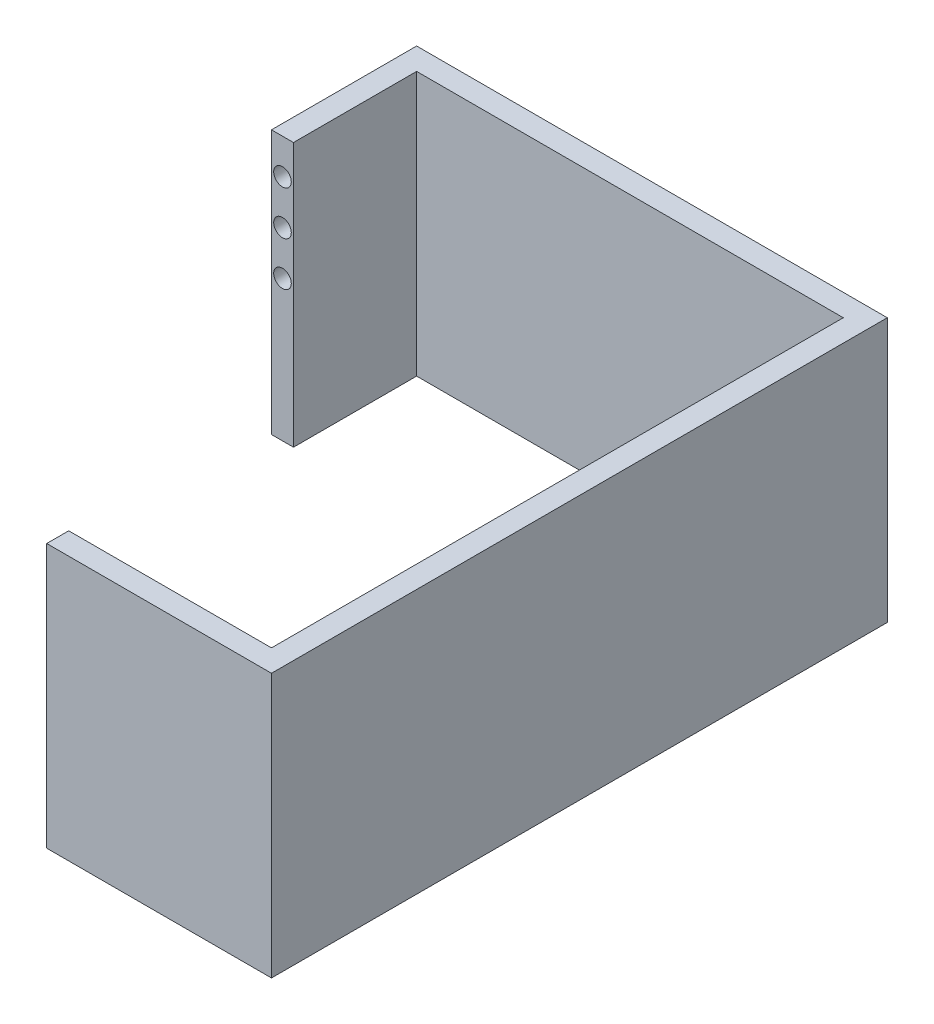
ISO-10303-21;
HEADER;
FILE_DESCRIPTION(('STEP AP214'),'2;1');
FILE_NAME('part.step','',(''),(''),'','','');
FILE_SCHEMA(('AUTOMOTIVE_DESIGN { 1 0 10303 214 1 1 1 1 }'));
ENDSEC;
DATA;
#1=APPLICATION_CONTEXT('core data for automotive mechanical design processes');
#2=APPLICATION_PROTOCOL_DEFINITION('international standard','automotive_design',2000,#1);
#3=PRODUCT_CONTEXT('',#1,'mechanical');
#4=PRODUCT('Part','Part','',(#3));
#5=PRODUCT_RELATED_PRODUCT_CATEGORY('part','',(#4));
#6=PRODUCT_DEFINITION_FORMATION('','',#4);
#7=PRODUCT_DEFINITION_CONTEXT('part definition',#1,'design');
#8=PRODUCT_DEFINITION('design','',#6,#7);
#9=PRODUCT_DEFINITION_SHAPE('','',#8);
#10=(LENGTH_UNIT() NAMED_UNIT(*) SI_UNIT(.MILLI.,.METRE.));
#11=(NAMED_UNIT(*) PLANE_ANGLE_UNIT() SI_UNIT($,.RADIAN.));
#12=(NAMED_UNIT(*) SI_UNIT($,.STERADIAN.) SOLID_ANGLE_UNIT());
#13=UNCERTAINTY_MEASURE_WITH_UNIT(LENGTH_MEASURE(1.E-05),#10,'distance_accuracy_value','');
#14=(GEOMETRIC_REPRESENTATION_CONTEXT(3) GLOBAL_UNCERTAINTY_ASSIGNED_CONTEXT((#13)) GLOBAL_UNIT_ASSIGNED_CONTEXT((#10,
#11,#12)) REPRESENTATION_CONTEXT('',''));
#15=CARTESIAN_POINT('',(0.,0.,0.));
#16=DIRECTION('',(0.,0.,1.));
#17=DIRECTION('',(1.,0.,0.));
#18=AXIS2_PLACEMENT_3D('',#15,#16,#17);
#19=CARTESIAN_POINT('',(-27.7844387904068,76.2,0.));
#20=DIRECTION('',(-1.,0.,0.));
#21=DIRECTION('',(0.,0.,1.));
#22=AXIS2_PLACEMENT_3D('',#19,#20,#21);
#23=PLANE('',#22);
#24=CARTESIAN_POINT('',(-27.7844387904068,40.64,7.40049259405421));
#25=DIRECTION('',(-1.,0.,0.));
#26=DIRECTION('',(0.,0.,1.));
#27=AXIS2_PLACEMENT_3D('',#24,#25,#26);
#28=CIRCLE('',#27,2.54);
#29=CARTESIAN_POINT('',(-27.7844387904068,40.64,9.94049259405421));
#30=VERTEX_POINT('',#29);
#31=EDGE_CURVE('E281',#30,#30,#28,.T.);
#32=ORIENTED_EDGE('',*,*,#31,.F.);
#33=EDGE_LOOP('',(#32));
#34=FACE_BOUND('',#33,.T.);
#35=CARTESIAN_POINT('',(-27.7844387904068,53.34,7.40049259405407));
#36=DIRECTION('',(-1.,0.,0.));
#37=DIRECTION('',(0.,0.,1.));
#38=AXIS2_PLACEMENT_3D('',#35,#36,#37);
#39=CIRCLE('',#38,2.54);
#40=CARTESIAN_POINT('',(-27.7844387904068,53.34,9.94049259405408));
#41=VERTEX_POINT('',#40);
#42=EDGE_CURVE('E273',#41,#41,#39,.T.);
#43=ORIENTED_EDGE('',*,*,#42,.F.);
#44=EDGE_LOOP('',(#43));
#45=FACE_BOUND('',#44,.T.);
#46=CARTESIAN_POINT('',(-27.7844387904068,66.04,7.40049259405394));
#47=DIRECTION('',(-1.,0.,0.));
#48=DIRECTION('',(0.,0.,1.));
#49=AXIS2_PLACEMENT_3D('',#46,#47,#48);
#50=CIRCLE('',#49,2.54);
#51=CARTESIAN_POINT('',(-27.7844387904068,66.04,9.94049259405394));
#52=VERTEX_POINT('',#51);
#53=EDGE_CURVE('E266',#52,#52,#50,.T.);
#54=ORIENTED_EDGE('',*,*,#53,.F.);
#55=EDGE_LOOP('',(#54));
#56=FACE_BOUND('',#55,.T.);
#57=DIRECTION('',(0.,0.,-1.));
#58=VECTOR('',#57,1.);
#59=CARTESIAN_POINT('',(-27.7844387904068,0.,0.));
#60=LINE('',#59,#58);
#61=CARTESIAN_POINT('',(-27.7844387904068,0.,10.5754925940539));
#62=VERTEX_POINT('',#61);
#63=CARTESIAN_POINT('',(-27.7844387904068,0.,4.22549259405394));
#64=VERTEX_POINT('',#63);
#65=EDGE_CURVE('E165',#62,#64,#60,.T.);
#66=ORIENTED_EDGE('',*,*,#65,.F.);
#67=DIRECTION('',(0.,-1.,0.));
#68=VECTOR('',#67,1.);
#69=CARTESIAN_POINT('',(-27.7844387904068,76.2,10.5754925940539));
#70=LINE('',#69,#68);
#71=CARTESIAN_POINT('',(-27.7844387904068,76.2,10.5754925940539));
#72=VERTEX_POINT('',#71);
#73=EDGE_CURVE('E11',#72,#62,#70,.T.);
#74=ORIENTED_EDGE('',*,*,#73,.F.);
#75=DIRECTION('',(0.,0.,-1.));
#76=VECTOR('',#75,1.);
#77=CARTESIAN_POINT('',(-27.7844387904068,76.2,0.));
#78=LINE('',#77,#76);
#79=CARTESIAN_POINT('',(-27.7844387904068,76.2,4.22549259405394));
#80=VERTEX_POINT('',#79);
#81=EDGE_CURVE('E199',#72,#80,#78,.T.);
#82=ORIENTED_EDGE('',*,*,#81,.T.);
#83=DIRECTION('',(0.,-1.,0.));
#84=VECTOR('',#83,1.);
#85=CARTESIAN_POINT('',(-27.7844387904068,76.2,4.22549259405394));
#86=LINE('',#85,#84);
#87=EDGE_CURVE('E105',#80,#64,#86,.T.);
#88=ORIENTED_EDGE('',*,*,#87,.T.);
#89=EDGE_LOOP('',(#66,#74,#82,#88));
#90=FACE_BOUND('',#89,.T.);
#91=ADVANCED_FACE('F40',(#34,#45,#56,#90),#23,.T.);
#92=CARTESIAN_POINT('',(0.,76.2,10.5754925940539));
#93=DIRECTION('',(0.,0.,1.));
#94=DIRECTION('',(1.,0.,0.));
#95=AXIS2_PLACEMENT_3D('',#92,#93,#94);
#96=PLANE('',#95);
#97=DIRECTION('',(-1.,0.,0.));
#98=VECTOR('',#97,1.);
#99=CARTESIAN_POINT('',(0.,0.,10.5754925940539));
#100=LINE('',#99,#98);
#101=CARTESIAN_POINT('',(37.1125612095932,0.,10.5754925940539));
#102=VERTEX_POINT('',#101);
#103=EDGE_CURVE('E169',#102,#62,#100,.T.);
#104=ORIENTED_EDGE('',*,*,#103,.F.);
#105=DIRECTION('',(0.,-1.,0.));
#106=VECTOR('',#105,1.);
#107=CARTESIAN_POINT('',(37.1125612095932,76.2,10.5754925940539));
#108=LINE('',#107,#106);
#109=CARTESIAN_POINT('',(37.1125612095932,76.2,10.5754925940539));
#110=VERTEX_POINT('',#109);
#111=EDGE_CURVE('E49',#110,#102,#108,.T.);
#112=ORIENTED_EDGE('',*,*,#111,.F.);
#113=DIRECTION('',(-1.,0.,0.));
#114=VECTOR('',#113,1.);
#115=CARTESIAN_POINT('',(0.,76.2,10.5754925940539));
#116=LINE('',#115,#114);
#117=EDGE_CURVE('E241',#110,#72,#116,.T.);
#118=ORIENTED_EDGE('',*,*,#117,.T.);
#119=ORIENTED_EDGE('',*,*,#73,.T.);
#120=EDGE_LOOP('',(#104,#112,#118,#119));
#121=FACE_BOUND('',#120,.T.);
#122=ADVANCED_FACE('F229',(#121),#96,.T.);
#123=CARTESIAN_POINT('',(37.1125612095932,76.2,0.));
#124=DIRECTION('',(1.,0.,0.));
#125=DIRECTION('',(0.,0.,-1.));
#126=AXIS2_PLACEMENT_3D('',#123,#124,#125);
#127=PLANE('',#126);
#128=DIRECTION('',(0.,0.,1.));
#129=VECTOR('',#128,1.);
#130=CARTESIAN_POINT('',(37.1125612095932,0.,0.));
#131=LINE('',#130,#129);
#132=CARTESIAN_POINT('',(37.1125612095932,0.,-167.224507405946));
#133=VERTEX_POINT('',#132);
#134=EDGE_CURVE('E174',#133,#102,#131,.T.);
#135=ORIENTED_EDGE('',*,*,#134,.F.);
#136=DIRECTION('',(0.,-1.,0.));
#137=VECTOR('',#136,1.);
#138=CARTESIAN_POINT('',(37.1125612095932,76.2,-167.224507405946));
#139=LINE('',#138,#137);
#140=CARTESIAN_POINT('',(37.1125612095932,76.2,-167.224507405946));
#141=VERTEX_POINT('',#140);
#142=EDGE_CURVE('E216',#141,#133,#139,.T.);
#143=ORIENTED_EDGE('',*,*,#142,.F.);
#144=DIRECTION('',(0.,0.,1.));
#145=VECTOR('',#144,1.);
#146=CARTESIAN_POINT('',(37.1125612095932,76.2,0.));
#147=LINE('',#146,#145);
#148=EDGE_CURVE('E225',#141,#110,#147,.T.);
#149=ORIENTED_EDGE('',*,*,#148,.T.);
#150=ORIENTED_EDGE('',*,*,#111,.T.);
#151=EDGE_LOOP('',(#135,#143,#149,#150));
#152=FACE_BOUND('',#151,.T.);
#153=ADVANCED_FACE('F223',(#152),#127,.T.);
#154=CARTESIAN_POINT('',(0.,76.2,-167.224507405946));
#155=DIRECTION('',(0.,0.,-1.));
#156=DIRECTION('',(-1.,0.,0.));
#157=AXIS2_PLACEMENT_3D('',#154,#155,#156);
#158=PLANE('',#157);
#159=DIRECTION('',(1.,0.,0.));
#160=VECTOR('',#159,1.);
#161=CARTESIAN_POINT('',(0.,0.,-167.224507405946));
#162=LINE('',#161,#160);
#163=CARTESIAN_POINT('',(-98.7774387904068,0.,-167.224507405946));
#164=VERTEX_POINT('',#163);
#165=EDGE_CURVE('E178',#164,#133,#162,.T.);
#166=ORIENTED_EDGE('',*,*,#165,.F.);
#167=DIRECTION('',(0.,-1.,0.));
#168=VECTOR('',#167,1.);
#169=CARTESIAN_POINT('',(-98.7774387904068,76.2,-167.224507405946));
#170=LINE('',#169,#168);
#171=CARTESIAN_POINT('',(-98.7774387904068,76.2,-167.224507405946));
#172=VERTEX_POINT('',#171);
#173=EDGE_CURVE('E213',#172,#164,#170,.T.);
#174=ORIENTED_EDGE('',*,*,#173,.F.);
#175=DIRECTION('',(1.,0.,0.));
#176=VECTOR('',#175,1.);
#177=CARTESIAN_POINT('',(0.,76.2,-167.224507405946));
#178=LINE('',#177,#176);
#179=EDGE_CURVE('E240',#172,#141,#178,.T.);
#180=ORIENTED_EDGE('',*,*,#179,.T.);
#181=ORIENTED_EDGE('',*,*,#142,.T.);
#182=EDGE_LOOP('',(#166,#174,#180,#181));
#183=FACE_BOUND('',#182,.T.);
#184=ADVANCED_FACE('F236',(#183),#158,.T.);
#185=CARTESIAN_POINT('',(-98.7774387904068,76.2,0.));
#186=DIRECTION('',(1.,0.,0.));
#187=DIRECTION('',(0.,0.,-1.));
#188=AXIS2_PLACEMENT_3D('',#185,#186,#187);
#189=PLANE('',#188);
#190=DIRECTION('',(0.,0.,1.));
#191=VECTOR('',#190,1.);
#192=CARTESIAN_POINT('',(-98.7774387904068,0.,0.));
#193=LINE('',#192,#191);
#194=CARTESIAN_POINT('',(-98.7774387904068,0.,-125.314507405946));
#195=VERTEX_POINT('',#194);
#196=EDGE_CURVE('E182',#164,#195,#193,.T.);
#197=ORIENTED_EDGE('',*,*,#196,.T.);
#198=DIRECTION('',(0.,-1.,0.));
#199=VECTOR('',#198,1.);
#200=CARTESIAN_POINT('',(-98.7774387904068,76.2,-125.314507405946));
#201=LINE('',#200,#199);
#202=CARTESIAN_POINT('',(-98.7774387904068,76.2,-125.314507405946));
#203=VERTEX_POINT('',#202);
#204=EDGE_CURVE('E209',#203,#195,#201,.T.);
#205=ORIENTED_EDGE('',*,*,#204,.F.);
#206=DIRECTION('',(0.,0.,1.));
#207=VECTOR('',#206,1.);
#208=CARTESIAN_POINT('',(-98.7774387904068,76.2,0.));
#209=LINE('',#208,#207);
#210=EDGE_CURVE('E245',#172,#203,#209,.T.);
#211=ORIENTED_EDGE('',*,*,#210,.F.);
#212=ORIENTED_EDGE('',*,*,#173,.T.);
#213=EDGE_LOOP('',(#197,#205,#211,#212));
#214=FACE_BOUND('',#213,.T.);
#215=ADVANCED_FACE('F323',(#214),#189,.F.);
#216=CARTESIAN_POINT('',(0.,76.2,-125.314507405946));
#217=DIRECTION('',(0.,0.,-1.));
#218=DIRECTION('',(-1.,0.,0.));
#219=AXIS2_PLACEMENT_3D('',#216,#217,#218);
#220=PLANE('',#219);
#221=CARTESIAN_POINT('',(-95.6024387904065,40.64,-125.314507405946));
#222=DIRECTION('',(0.,0.,1.));
#223=DIRECTION('',(1.,0.,0.));
#224=AXIS2_PLACEMENT_3D('',#221,#222,#223);
#225=CIRCLE('',#224,2.54);
#226=CARTESIAN_POINT('',(-93.0624387904065,40.64,-125.314507405946));
#227=VERTEX_POINT('',#226);
#228=EDGE_CURVE('E304',#227,#227,#225,.T.);
#229=ORIENTED_EDGE('',*,*,#228,.F.);
#230=EDGE_LOOP('',(#229));
#231=FACE_BOUND('',#230,.T.);
#232=CARTESIAN_POINT('',(-95.6024387904066,53.34,-125.314507405946));
#233=DIRECTION('',(0.,0.,1.));
#234=DIRECTION('',(1.,0.,0.));
#235=AXIS2_PLACEMENT_3D('',#232,#233,#234);
#236=CIRCLE('',#235,2.54);
#237=CARTESIAN_POINT('',(-93.0624387904066,53.34,-125.314507405946));
#238=VERTEX_POINT('',#237);
#239=EDGE_CURVE('E296',#238,#238,#236,.T.);
#240=ORIENTED_EDGE('',*,*,#239,.F.);
#241=EDGE_LOOP('',(#240));
#242=FACE_BOUND('',#241,.T.);
#243=CARTESIAN_POINT('',(-95.6024387904068,66.04,-125.314507405946));
#244=DIRECTION('',(0.,0.,1.));
#245=DIRECTION('',(1.,0.,0.));
#246=AXIS2_PLACEMENT_3D('',#243,#244,#245);
#247=CIRCLE('',#246,2.53999999999999);
#248=CARTESIAN_POINT('',(-93.0624387904068,66.04,-125.314507405946));
#249=VERTEX_POINT('',#248);
#250=EDGE_CURVE('E289',#249,#249,#247,.T.);
#251=ORIENTED_EDGE('',*,*,#250,.F.);
#252=EDGE_LOOP('',(#251));
#253=FACE_BOUND('',#252,.T.);
#254=DIRECTION('',(1.,0.,0.));
#255=VECTOR('',#254,1.);
#256=CARTESIAN_POINT('',(0.,0.,-125.314507405946));
#257=LINE('',#256,#255);
#258=CARTESIAN_POINT('',(-92.4274387904068,0.,-125.314507405946));
#259=VERTEX_POINT('',#258);
#260=EDGE_CURVE('E185',#195,#259,#257,.T.);
#261=ORIENTED_EDGE('',*,*,#260,.T.);
#262=DIRECTION('',(0.,-1.,0.));
#263=VECTOR('',#262,1.);
#264=CARTESIAN_POINT('',(-92.4274387904068,76.2,-125.314507405946));
#265=LINE('',#264,#263);
#266=CARTESIAN_POINT('',(-92.4274387904068,76.2,-125.314507405946));
#267=VERTEX_POINT('',#266);
#268=EDGE_CURVE('E206',#267,#259,#265,.T.);
#269=ORIENTED_EDGE('',*,*,#268,.F.);
#270=DIRECTION('',(1.,0.,0.));
#271=VECTOR('',#270,1.);
#272=CARTESIAN_POINT('',(0.,76.2,-125.314507405946));
#273=LINE('',#272,#271);
#274=EDGE_CURVE('E160',#203,#267,#273,.T.);
#275=ORIENTED_EDGE('',*,*,#274,.F.);
#276=ORIENTED_EDGE('',*,*,#204,.T.);
#277=EDGE_LOOP('',(#261,#269,#275,#276));
#278=FACE_BOUND('',#277,.T.);
#279=ADVANCED_FACE('F257',(#231,#242,#253,#278),#220,.F.);
#280=CARTESIAN_POINT('',(-92.4274387904068,76.2,0.));
#281=DIRECTION('',(1.,0.,0.));
#282=DIRECTION('',(0.,0.,-1.));
#283=AXIS2_PLACEMENT_3D('',#280,#281,#282);
#284=PLANE('',#283);
#285=DIRECTION('',(0.,0.,1.));
#286=VECTOR('',#285,1.);
#287=CARTESIAN_POINT('',(-92.4274387904068,0.,0.));
#288=LINE('',#287,#286);
#289=CARTESIAN_POINT('',(-92.4274387904068,0.,-160.874507405946));
#290=VERTEX_POINT('',#289);
#291=EDGE_CURVE('E188',#290,#259,#288,.T.);
#292=ORIENTED_EDGE('',*,*,#291,.F.);
#293=DIRECTION('',(0.,-1.,0.));
#294=VECTOR('',#293,1.);
#295=CARTESIAN_POINT('',(-92.4274387904068,76.2,-160.874507405946));
#296=LINE('',#295,#294);
#297=CARTESIAN_POINT('',(-92.4274387904068,76.2,-160.874507405946));
#298=VERTEX_POINT('',#297);
#299=EDGE_CURVE('E144',#298,#290,#296,.T.);
#300=ORIENTED_EDGE('',*,*,#299,.F.);
#301=DIRECTION('',(0.,0.,1.));
#302=VECTOR('',#301,1.);
#303=CARTESIAN_POINT('',(-92.4274387904068,76.2,0.));
#304=LINE('',#303,#302);
#305=EDGE_CURVE('E154',#298,#267,#304,.T.);
#306=ORIENTED_EDGE('',*,*,#305,.T.);
#307=ORIENTED_EDGE('',*,*,#268,.T.);
#308=EDGE_LOOP('',(#292,#300,#306,#307));
#309=FACE_BOUND('',#308,.T.);
#310=ADVANCED_FACE('F260',(#309),#284,.T.);
#311=CARTESIAN_POINT('',(0.,76.2,-160.874507405946));
#312=DIRECTION('',(0.,0.,1.));
#313=DIRECTION('',(1.,0.,0.));
#314=AXIS2_PLACEMENT_3D('',#311,#312,#313);
#315=PLANE('',#314);
#316=DIRECTION('',(-1.,0.,0.));
#317=VECTOR('',#316,1.);
#318=CARTESIAN_POINT('',(0.,0.,-160.874507405946));
#319=LINE('',#318,#317);
#320=CARTESIAN_POINT('',(30.7625612095932,0.,-160.874507405946));
#321=VERTEX_POINT('',#320);
#322=EDGE_CURVE('E142',#321,#290,#319,.T.);
#323=ORIENTED_EDGE('',*,*,#322,.F.);
#324=DIRECTION('',(0.,-1.,0.));
#325=VECTOR('',#324,1.);
#326=CARTESIAN_POINT('',(30.7625612095932,76.2,-160.874507405946));
#327=LINE('',#326,#325);
#328=CARTESIAN_POINT('',(30.7625612095932,76.2,-160.874507405946));
#329=VERTEX_POINT('',#328);
#330=EDGE_CURVE('E136',#329,#321,#327,.T.);
#331=ORIENTED_EDGE('',*,*,#330,.F.);
#332=DIRECTION('',(-1.,0.,0.));
#333=VECTOR('',#332,1.);
#334=CARTESIAN_POINT('',(0.,76.2,-160.874507405946));
#335=LINE('',#334,#333);
#336=EDGE_CURVE('E140',#329,#298,#335,.T.);
#337=ORIENTED_EDGE('',*,*,#336,.T.);
#338=ORIENTED_EDGE('',*,*,#299,.T.);
#339=EDGE_LOOP('',(#323,#331,#337,#338));
#340=FACE_BOUND('',#339,.T.);
#341=ADVANCED_FACE('F138',(#340),#315,.T.);
#342=CARTESIAN_POINT('',(30.7625612095932,76.2,0.));
#343=DIRECTION('',(1.,0.,0.));
#344=DIRECTION('',(0.,0.,-1.));
#345=AXIS2_PLACEMENT_3D('',#342,#343,#344);
#346=PLANE('',#345);
#347=DIRECTION('',(0.,0.,1.));
#348=VECTOR('',#347,1.);
#349=CARTESIAN_POINT('',(30.7625612095932,0.,0.));
#350=LINE('',#349,#348);
#351=CARTESIAN_POINT('',(30.7625612095932,0.,4.22549259405393));
#352=VERTEX_POINT('',#351);
#353=EDGE_CURVE('E97',#321,#352,#350,.T.);
#354=ORIENTED_EDGE('',*,*,#353,.T.);
#355=DIRECTION('',(0.,-1.,0.));
#356=VECTOR('',#355,1.);
#357=CARTESIAN_POINT('',(30.7625612095932,76.2,4.22549259405393));
#358=LINE('',#357,#356);
#359=CARTESIAN_POINT('',(30.7625612095932,76.2,4.22549259405393));
#360=VERTEX_POINT('',#359);
#361=EDGE_CURVE('E145',#360,#352,#358,.T.);
#362=ORIENTED_EDGE('',*,*,#361,.F.);
#363=DIRECTION('',(0.,0.,1.));
#364=VECTOR('',#363,1.);
#365=CARTESIAN_POINT('',(30.7625612095932,76.2,0.));
#366=LINE('',#365,#364);
#367=EDGE_CURVE('E147',#329,#360,#366,.T.);
#368=ORIENTED_EDGE('',*,*,#367,.F.);
#369=ORIENTED_EDGE('',*,*,#330,.T.);
#370=EDGE_LOOP('',(#354,#362,#368,#369));
#371=FACE_BOUND('',#370,.T.);
#372=ADVANCED_FACE('F148',(#371),#346,.F.);
#373=CARTESIAN_POINT('',(0.,76.2,4.22549259405394));
#374=DIRECTION('',(0.,0.,1.));
#375=DIRECTION('',(1.,0.,0.));
#376=AXIS2_PLACEMENT_3D('',#373,#374,#375);
#377=PLANE('',#376);
#378=DIRECTION('',(-1.,0.,0.));
#379=VECTOR('',#378,1.);
#380=CARTESIAN_POINT('',(0.,0.,4.22549259405394));
#381=LINE('',#380,#379);
#382=EDGE_CURVE('E196',#352,#64,#381,.T.);
#383=ORIENTED_EDGE('',*,*,#382,.T.);
#384=ORIENTED_EDGE('',*,*,#87,.F.);
#385=DIRECTION('',(-1.,0.,0.));
#386=VECTOR('',#385,1.);
#387=CARTESIAN_POINT('',(0.,76.2,4.22549259405394));
#388=LINE('',#387,#386);
#389=EDGE_CURVE('E60',#360,#80,#388,.T.);
#390=ORIENTED_EDGE('',*,*,#389,.F.);
#391=ORIENTED_EDGE('',*,*,#361,.T.);
#392=EDGE_LOOP('',(#383,#384,#390,#391));
#393=FACE_BOUND('',#392,.T.);
#394=ADVANCED_FACE('F263',(#393),#377,.F.);
#395=CARTESIAN_POINT('',(0.,76.2,0.));
#396=DIRECTION('',(0.,1.,0.));
#397=DIRECTION('',(0.,0.,1.));
#398=AXIS2_PLACEMENT_3D('',#395,#396,#397);
#399=PLANE('',#398);
#400=ORIENTED_EDGE('',*,*,#81,.F.);
#401=ORIENTED_EDGE('',*,*,#117,.F.);
#402=ORIENTED_EDGE('',*,*,#148,.F.);
#403=ORIENTED_EDGE('',*,*,#179,.F.);
#404=ORIENTED_EDGE('',*,*,#210,.T.);
#405=ORIENTED_EDGE('',*,*,#274,.T.);
#406=ORIENTED_EDGE('',*,*,#305,.F.);
#407=ORIENTED_EDGE('',*,*,#336,.F.);
#408=ORIENTED_EDGE('',*,*,#367,.T.);
#409=ORIENTED_EDGE('',*,*,#389,.T.);
#410=EDGE_LOOP('',(#400,#401,#402,#403,#404,#405,#406,#407,#408,#409));
#411=FACE_BOUND('',#410,.T.);
#412=ADVANCED_FACE('F152',(#411),#399,.T.);
#413=CARTESIAN_POINT('',(0.,0.,0.));
#414=DIRECTION('',(0.,1.,0.));
#415=DIRECTION('',(0.,0.,1.));
#416=AXIS2_PLACEMENT_3D('',#413,#414,#415);
#417=PLANE('',#416);
#418=ORIENTED_EDGE('',*,*,#65,.T.);
#419=ORIENTED_EDGE('',*,*,#382,.F.);
#420=ORIENTED_EDGE('',*,*,#353,.F.);
#421=ORIENTED_EDGE('',*,*,#322,.T.);
#422=ORIENTED_EDGE('',*,*,#291,.T.);
#423=ORIENTED_EDGE('',*,*,#260,.F.);
#424=ORIENTED_EDGE('',*,*,#196,.F.);
#425=ORIENTED_EDGE('',*,*,#165,.T.);
#426=ORIENTED_EDGE('',*,*,#134,.T.);
#427=ORIENTED_EDGE('',*,*,#103,.T.);
#428=EDGE_LOOP('',(#418,#419,#420,#421,#422,#423,#424,#425,#426,#427));
#429=FACE_BOUND('',#428,.T.);
#430=ADVANCED_FACE('F231',(#429),#417,.F.);
#431=CARTESIAN_POINT('',(-2.38443879040678,66.04,7.40049259405394));
#432=DIRECTION('',(-1.,0.,0.));
#433=DIRECTION('',(0.,0.,1.));
#434=AXIS2_PLACEMENT_3D('',#431,#432,#433);
#435=CYLINDRICAL_SURFACE('',#434,2.54);
#436=CARTESIAN_POINT('',(-2.38443879040678,66.04,7.40049259405394));
#437=DIRECTION('',(-1.,0.,0.));
#438=DIRECTION('',(0.,0.,1.));
#439=AXIS2_PLACEMENT_3D('',#436,#437,#438);
#440=CIRCLE('',#439,2.54);
#441=CARTESIAN_POINT('',(-2.38443879040678,66.04,9.94049259405394));
#442=VERTEX_POINT('',#441);
#443=EDGE_CURVE('E170',#442,#442,#440,.T.);
#444=ORIENTED_EDGE('',*,*,#443,.F.);
#445=EDGE_LOOP('',(#444));
#446=FACE_BOUND('',#445,.T.);
#447=ORIENTED_EDGE('',*,*,#53,.T.);
#448=EDGE_LOOP('',(#447));
#449=FACE_BOUND('',#448,.T.);
#450=ADVANCED_FACE('F357',(#446,#449),#435,.F.);
#451=CARTESIAN_POINT('',(-2.38443879040678,66.04,7.40049259405394));
#452=DIRECTION('',(-1.,0.,0.));
#453=DIRECTION('',(0.,0.,1.));
#454=AXIS2_PLACEMENT_3D('',#451,#452,#453);
#455=PLANE('',#454);
#456=ORIENTED_EDGE('',*,*,#443,.T.);
#457=EDGE_LOOP('',(#456));
#458=FACE_BOUND('',#457,.T.);
#459=ADVANCED_FACE('F359',(#458),#455,.T.);
#460=CARTESIAN_POINT('',(-2.38443879040678,53.34,7.40049259405407));
#461=DIRECTION('',(-1.,0.,0.));
#462=DIRECTION('',(0.,0.,1.));
#463=AXIS2_PLACEMENT_3D('',#460,#461,#462);
#464=CYLINDRICAL_SURFACE('',#463,2.54);
#465=CARTESIAN_POINT('',(-2.38443879040678,53.34,7.40049259405407));
#466=DIRECTION('',(-1.,0.,0.));
#467=DIRECTION('',(0.,0.,1.));
#468=AXIS2_PLACEMENT_3D('',#465,#466,#467);
#469=CIRCLE('',#468,2.54);
#470=CARTESIAN_POINT('',(-2.38443879040678,53.34,9.94049259405408));
#471=VERTEX_POINT('',#470);
#472=EDGE_CURVE('E269',#471,#471,#469,.T.);
#473=ORIENTED_EDGE('',*,*,#472,.F.);
#474=EDGE_LOOP('',(#473));
#475=FACE_BOUND('',#474,.T.);
#476=ORIENTED_EDGE('',*,*,#42,.T.);
#477=EDGE_LOOP('',(#476));
#478=FACE_BOUND('',#477,.T.);
#479=ADVANCED_FACE('F366',(#475,#478),#464,.F.);
#480=CARTESIAN_POINT('',(-2.38443879040678,53.34,7.40049259405407));
#481=DIRECTION('',(-1.,0.,0.));
#482=DIRECTION('',(0.,0.,1.));
#483=AXIS2_PLACEMENT_3D('',#480,#481,#482);
#484=PLANE('',#483);
#485=ORIENTED_EDGE('',*,*,#472,.T.);
#486=EDGE_LOOP('',(#485));
#487=FACE_BOUND('',#486,.T.);
#488=ADVANCED_FACE('F450',(#487),#484,.T.);
#489=CARTESIAN_POINT('',(-2.38443879040678,40.64,7.40049259405421));
#490=DIRECTION('',(-1.,0.,0.));
#491=DIRECTION('',(0.,0.,1.));
#492=AXIS2_PLACEMENT_3D('',#489,#490,#491);
#493=CYLINDRICAL_SURFACE('',#492,2.54);
#494=CARTESIAN_POINT('',(-2.38443879040678,40.64,7.40049259405421));
#495=DIRECTION('',(-1.,0.,0.));
#496=DIRECTION('',(0.,0.,1.));
#497=AXIS2_PLACEMENT_3D('',#494,#495,#496);
#498=CIRCLE('',#497,2.54);
#499=CARTESIAN_POINT('',(-2.38443879040678,40.64,9.94049259405421));
#500=VERTEX_POINT('',#499);
#501=EDGE_CURVE('E277',#500,#500,#498,.T.);
#502=ORIENTED_EDGE('',*,*,#501,.F.);
#503=EDGE_LOOP('',(#502));
#504=FACE_BOUND('',#503,.T.);
#505=ORIENTED_EDGE('',*,*,#31,.T.);
#506=EDGE_LOOP('',(#505));
#507=FACE_BOUND('',#506,.T.);
#508=ADVANCED_FACE('F342',(#504,#507),#493,.F.);
#509=CARTESIAN_POINT('',(-2.38443879040678,40.64,7.40049259405421));
#510=DIRECTION('',(-1.,0.,0.));
#511=DIRECTION('',(0.,0.,1.));
#512=AXIS2_PLACEMENT_3D('',#509,#510,#511);
#513=PLANE('',#512);
#514=ORIENTED_EDGE('',*,*,#501,.T.);
#515=EDGE_LOOP('',(#514));
#516=FACE_BOUND('',#515,.T.);
#517=ADVANCED_FACE('F332',(#516),#513,.T.);
#518=CARTESIAN_POINT('',(-95.6024387904068,66.04,-150.714507405946));
#519=DIRECTION('',(0.,0.,1.));
#520=DIRECTION('',(1.,0.,0.));
#521=AXIS2_PLACEMENT_3D('',#518,#519,#520);
#522=CYLINDRICAL_SURFACE('',#521,2.53999999999999);
#523=CARTESIAN_POINT('',(-95.6024387904068,66.04,-150.714507405946));
#524=DIRECTION('',(0.,0.,1.));
#525=DIRECTION('',(1.,0.,0.));
#526=AXIS2_PLACEMENT_3D('',#523,#524,#525);
#527=CIRCLE('',#526,2.53999999999999);
#528=CARTESIAN_POINT('',(-93.0624387904068,66.04,-150.714507405946));
#529=VERTEX_POINT('',#528);
#530=EDGE_CURVE('E285',#529,#529,#527,.T.);
#531=ORIENTED_EDGE('',*,*,#530,.F.);
#532=EDGE_LOOP('',(#531));
#533=FACE_BOUND('',#532,.T.);
#534=ORIENTED_EDGE('',*,*,#250,.T.);
#535=EDGE_LOOP('',(#534));
#536=FACE_BOUND('',#535,.T.);
#537=ADVANCED_FACE('F329',(#533,#536),#522,.F.);
#538=CARTESIAN_POINT('',(-95.6024387904068,66.04,-150.714507405946));
#539=DIRECTION('',(0.,0.,1.));
#540=DIRECTION('',(1.,0.,0.));
#541=AXIS2_PLACEMENT_3D('',#538,#539,#540);
#542=PLANE('',#541);
#543=ORIENTED_EDGE('',*,*,#530,.T.);
#544=EDGE_LOOP('',(#543));
#545=FACE_BOUND('',#544,.T.);
#546=ADVANCED_FACE('F331',(#545),#542,.T.);
#547=CARTESIAN_POINT('',(-95.6024387904066,53.34,-150.714507405946));
#548=DIRECTION('',(0.,0.,1.));
#549=DIRECTION('',(1.,0.,0.));
#550=AXIS2_PLACEMENT_3D('',#547,#548,#549);
#551=CYLINDRICAL_SURFACE('',#550,2.54);
#552=CARTESIAN_POINT('',(-95.6024387904066,53.34,-150.714507405946));
#553=DIRECTION('',(0.,0.,1.));
#554=DIRECTION('',(1.,0.,0.));
#555=AXIS2_PLACEMENT_3D('',#552,#553,#554);
#556=CIRCLE('',#555,2.54);
#557=CARTESIAN_POINT('',(-93.0624387904066,53.34,-150.714507405946));
#558=VERTEX_POINT('',#557);
#559=EDGE_CURVE('E293',#558,#558,#556,.T.);
#560=ORIENTED_EDGE('',*,*,#559,.F.);
#561=EDGE_LOOP('',(#560));
#562=FACE_BOUND('',#561,.T.);
#563=ORIENTED_EDGE('',*,*,#239,.T.);
#564=EDGE_LOOP('',(#563));
#565=FACE_BOUND('',#564,.T.);
#566=ADVANCED_FACE('F339',(#562,#565),#551,.F.);
#567=CARTESIAN_POINT('',(-95.6024387904066,53.34,-150.714507405946));
#568=DIRECTION('',(0.,0.,1.));
#569=DIRECTION('',(1.,0.,0.));
#570=AXIS2_PLACEMENT_3D('',#567,#568,#569);
#571=PLANE('',#570);
#572=ORIENTED_EDGE('',*,*,#559,.T.);
#573=EDGE_LOOP('',(#572));
#574=FACE_BOUND('',#573,.T.);
#575=ADVANCED_FACE('F317',(#574),#571,.T.);
#576=CARTESIAN_POINT('',(-95.6024387904065,40.64,-150.714507405946));
#577=DIRECTION('',(0.,0.,1.));
#578=DIRECTION('',(1.,0.,0.));
#579=AXIS2_PLACEMENT_3D('',#576,#577,#578);
#580=CYLINDRICAL_SURFACE('',#579,2.54);
#581=CARTESIAN_POINT('',(-95.6024387904065,40.64,-150.714507405946));
#582=DIRECTION('',(0.,0.,1.));
#583=DIRECTION('',(1.,0.,0.));
#584=AXIS2_PLACEMENT_3D('',#581,#582,#583);
#585=CIRCLE('',#584,2.54);
#586=CARTESIAN_POINT('',(-93.0624387904065,40.64,-150.714507405946));
#587=VERTEX_POINT('',#586);
#588=EDGE_CURVE('E300',#587,#587,#585,.T.);
#589=ORIENTED_EDGE('',*,*,#588,.F.);
#590=EDGE_LOOP('',(#589));
#591=FACE_BOUND('',#590,.T.);
#592=ORIENTED_EDGE('',*,*,#228,.T.);
#593=EDGE_LOOP('',(#592));
#594=FACE_BOUND('',#593,.T.);
#595=ADVANCED_FACE('F314',(#591,#594),#580,.F.);
#596=CARTESIAN_POINT('',(-95.6024387904065,40.64,-150.714507405946));
#597=DIRECTION('',(0.,0.,1.));
#598=DIRECTION('',(1.,0.,0.));
#599=AXIS2_PLACEMENT_3D('',#596,#597,#598);
#600=PLANE('',#599);
#601=ORIENTED_EDGE('',*,*,#588,.T.);
#602=EDGE_LOOP('',(#601));
#603=FACE_BOUND('',#602,.T.);
#604=ADVANCED_FACE('F312',(#603),#600,.T.);
#605=CLOSED_SHELL('',(#91,#122,#153,#184,#215,#279,#310,#341,#372,#394,#412,#430,#450,#459,#479,
#488,#508,#517,#537,#546,#566,#575,#595,#604));
#606=MANIFOLD_SOLID_BREP('B2',#605);
#607=ADVANCED_BREP_SHAPE_REPRESENTATION('',(#18,#606),#14);
#608=SHAPE_DEFINITION_REPRESENTATION(#9,#607);
ENDSEC;
END-ISO-10303-21;
